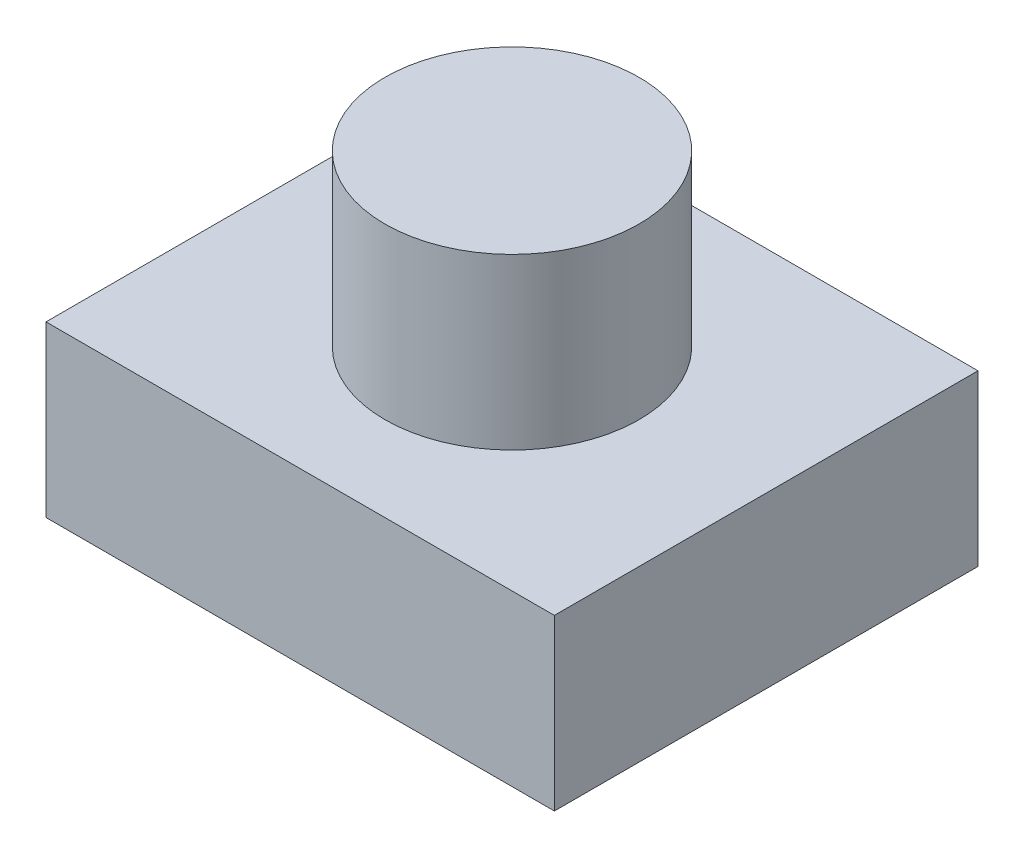
ISO-10303-21;
HEADER;
FILE_DESCRIPTION(('STEP AP214'),'2;1');
FILE_NAME('part.step','',(''),(''),'','','');
FILE_SCHEMA(('AUTOMOTIVE_DESIGN { 1 0 10303 214 1 1 1 1 }'));
ENDSEC;
DATA;
#1=APPLICATION_CONTEXT('core data for automotive mechanical design processes');
#2=APPLICATION_PROTOCOL_DEFINITION('international standard','automotive_design',2000,#1);
#3=PRODUCT_CONTEXT('',#1,'mechanical');
#4=PRODUCT('Part','Part','',(#3));
#5=PRODUCT_RELATED_PRODUCT_CATEGORY('part','',(#4));
#6=PRODUCT_DEFINITION_FORMATION('','',#4);
#7=PRODUCT_DEFINITION_CONTEXT('part definition',#1,'design');
#8=PRODUCT_DEFINITION('design','',#6,#7);
#9=PRODUCT_DEFINITION_SHAPE('','',#8);
#10=(LENGTH_UNIT() NAMED_UNIT(*) SI_UNIT(.MILLI.,.METRE.));
#11=(NAMED_UNIT(*) PLANE_ANGLE_UNIT() SI_UNIT($,.RADIAN.));
#12=(NAMED_UNIT(*) SI_UNIT($,.STERADIAN.) SOLID_ANGLE_UNIT());
#13=UNCERTAINTY_MEASURE_WITH_UNIT(LENGTH_MEASURE(1.E-05),#10,'distance_accuracy_value','');
#14=(GEOMETRIC_REPRESENTATION_CONTEXT(3) GLOBAL_UNCERTAINTY_ASSIGNED_CONTEXT((#13)) GLOBAL_UNIT_ASSIGNED_CONTEXT((#10,
#11,#12)) REPRESENTATION_CONTEXT('',''));
#15=CARTESIAN_POINT('',(0.,0.,0.));
#16=DIRECTION('',(0.,0.,1.));
#17=DIRECTION('',(1.,0.,0.));
#18=AXIS2_PLACEMENT_3D('',#15,#16,#17);
#19=CARTESIAN_POINT('',(-50.5445411922304,20.,13.2253851306095));
#20=DIRECTION('',(1.,0.,0.));
#21=DIRECTION('',(0.,0.,-1.));
#22=AXIS2_PLACEMENT_3D('',#19,#20,#21);
#23=PLANE('',#22);
#24=DIRECTION('',(0.,0.,1.));
#25=VECTOR('',#24,1.);
#26=CARTESIAN_POINT('',(-50.5445411922304,0.,13.2253851306095));
#27=LINE('',#26,#25);
#28=CARTESIAN_POINT('',(-50.5445411922304,0.,-36.7746148693905));
#29=VERTEX_POINT('',#28);
#30=CARTESIAN_POINT('',(-50.5445411922304,0.,13.2253851306095));
#31=VERTEX_POINT('',#30);
#32=EDGE_CURVE('E99',#29,#31,#27,.T.);
#33=ORIENTED_EDGE('',*,*,#32,.T.);
#34=DIRECTION('',(0.,-1.,0.));
#35=VECTOR('',#34,1.);
#36=CARTESIAN_POINT('',(-50.5445411922304,20.,13.2253851306095));
#37=LINE('',#36,#35);
#38=CARTESIAN_POINT('',(-50.5445411922304,20.,13.2253851306095));
#39=VERTEX_POINT('',#38);
#40=EDGE_CURVE('E36',#39,#31,#37,.T.);
#41=ORIENTED_EDGE('',*,*,#40,.F.);
#42=DIRECTION('',(0.,0.,1.));
#43=VECTOR('',#42,1.);
#44=CARTESIAN_POINT('',(-50.5445411922304,20.,13.2253851306095));
#45=LINE('',#44,#43);
#46=CARTESIAN_POINT('',(-50.5445411922304,20.,-36.7746148693905));
#47=VERTEX_POINT('',#46);
#48=EDGE_CURVE('E86',#47,#39,#45,.T.);
#49=ORIENTED_EDGE('',*,*,#48,.F.);
#50=DIRECTION('',(0.,-1.,0.));
#51=VECTOR('',#50,1.);
#52=CARTESIAN_POINT('',(-50.5445411922304,20.,-36.7746148693905));
#53=LINE('',#52,#51);
#54=EDGE_CURVE('E95',#47,#29,#53,.T.);
#55=ORIENTED_EDGE('',*,*,#54,.T.);
#56=EDGE_LOOP('',(#33,#41,#49,#55));
#57=FACE_BOUND('',#56,.T.);
#58=ADVANCED_FACE('F33',(#57),#23,.F.);
#59=CARTESIAN_POINT('',(-50.5445411922304,20.,13.2253851306095));
#60=DIRECTION('',(0.,0.,-1.));
#61=DIRECTION('',(-1.,0.,0.));
#62=AXIS2_PLACEMENT_3D('',#59,#60,#61);
#63=PLANE('',#62);
#64=DIRECTION('',(1.,0.,0.));
#65=VECTOR('',#64,1.);
#66=CARTESIAN_POINT('',(-50.5445411922304,0.,13.2253851306095));
#67=LINE('',#66,#65);
#68=CARTESIAN_POINT('',(9.4554588077696,0.,13.2253851306095));
#69=VERTEX_POINT('',#68);
#70=EDGE_CURVE('E91',#31,#69,#67,.T.);
#71=ORIENTED_EDGE('',*,*,#70,.T.);
#72=DIRECTION('',(0.,-1.,0.));
#73=VECTOR('',#72,1.);
#74=CARTESIAN_POINT('',(9.4554588077696,20.,13.2253851306095));
#75=LINE('',#74,#73);
#76=CARTESIAN_POINT('',(9.4554588077696,20.,13.2253851306095));
#77=VERTEX_POINT('',#76);
#78=EDGE_CURVE('E89',#77,#69,#75,.T.);
#79=ORIENTED_EDGE('',*,*,#78,.F.);
#80=DIRECTION('',(1.,0.,0.));
#81=VECTOR('',#80,1.);
#82=CARTESIAN_POINT('',(-50.5445411922304,20.,13.2253851306095));
#83=LINE('',#82,#81);
#84=EDGE_CURVE('E81',#39,#77,#83,.T.);
#85=ORIENTED_EDGE('',*,*,#84,.F.);
#86=ORIENTED_EDGE('',*,*,#40,.T.);
#87=EDGE_LOOP('',(#71,#79,#85,#86));
#88=FACE_BOUND('',#87,.T.);
#89=ADVANCED_FACE('F90',(#88),#63,.F.);
#90=CARTESIAN_POINT('',(9.4554588077696,20.,13.2253851306095));
#91=DIRECTION('',(-1.,0.,0.));
#92=DIRECTION('',(0.,0.,1.));
#93=AXIS2_PLACEMENT_3D('',#90,#91,#92);
#94=PLANE('',#93);
#95=DIRECTION('',(0.,0.,-1.));
#96=VECTOR('',#95,1.);
#97=CARTESIAN_POINT('',(9.4554588077696,0.,13.2253851306095));
#98=LINE('',#97,#96);
#99=CARTESIAN_POINT('',(9.4554588077696,0.,-36.7746148693905));
#100=VERTEX_POINT('',#99);
#101=EDGE_CURVE('E67',#69,#100,#98,.T.);
#102=ORIENTED_EDGE('',*,*,#101,.T.);
#103=DIRECTION('',(0.,-1.,0.));
#104=VECTOR('',#103,1.);
#105=CARTESIAN_POINT('',(9.4554588077696,20.,-36.7746148693905));
#106=LINE('',#105,#104);
#107=CARTESIAN_POINT('',(9.4554588077696,20.,-36.7746148693905));
#108=VERTEX_POINT('',#107);
#109=EDGE_CURVE('E92',#108,#100,#106,.T.);
#110=ORIENTED_EDGE('',*,*,#109,.F.);
#111=DIRECTION('',(0.,0.,-1.));
#112=VECTOR('',#111,1.);
#113=CARTESIAN_POINT('',(9.4554588077696,20.,13.2253851306095));
#114=LINE('',#113,#112);
#115=EDGE_CURVE('E84',#77,#108,#114,.T.);
#116=ORIENTED_EDGE('',*,*,#115,.F.);
#117=ORIENTED_EDGE('',*,*,#78,.T.);
#118=EDGE_LOOP('',(#102,#110,#116,#117));
#119=FACE_BOUND('',#118,.T.);
#120=ADVANCED_FACE('F93',(#119),#94,.F.);
#121=CARTESIAN_POINT('',(-50.5445411922304,20.,-36.7746148693905));
#122=DIRECTION('',(0.,0.,1.));
#123=DIRECTION('',(1.,0.,0.));
#124=AXIS2_PLACEMENT_3D('',#121,#122,#123);
#125=PLANE('',#124);
#126=DIRECTION('',(-1.,0.,0.));
#127=VECTOR('',#126,1.);
#128=CARTESIAN_POINT('',(-50.5445411922304,0.,-36.7746148693905));
#129=LINE('',#128,#127);
#130=EDGE_CURVE('E73',#100,#29,#129,.T.);
#131=ORIENTED_EDGE('',*,*,#130,.T.);
#132=ORIENTED_EDGE('',*,*,#54,.F.);
#133=DIRECTION('',(-1.,0.,0.));
#134=VECTOR('',#133,1.);
#135=CARTESIAN_POINT('',(-50.5445411922304,20.,-36.7746148693905));
#136=LINE('',#135,#134);
#137=EDGE_CURVE('E50',#108,#47,#136,.T.);
#138=ORIENTED_EDGE('',*,*,#137,.F.);
#139=ORIENTED_EDGE('',*,*,#109,.T.);
#140=EDGE_LOOP('',(#131,#132,#138,#139));
#141=FACE_BOUND('',#140,.T.);
#142=ADVANCED_FACE('F107',(#141),#125,.F.);
#143=CARTESIAN_POINT('',(0.,20.,0.));
#144=DIRECTION('',(0.,-1.,0.));
#145=DIRECTION('',(0.,0.,-1.));
#146=AXIS2_PLACEMENT_3D('',#143,#144,#145);
#147=PLANE('',#146);
#148=CARTESIAN_POINT('',(-20.5445411922304,20.,-11.7746148693905));
#149=DIRECTION('',(0.,1.,0.));
#150=DIRECTION('',(0.,0.,1.));
#151=AXIS2_PLACEMENT_3D('',#148,#149,#150);
#152=CIRCLE('',#151,15.);
#153=CARTESIAN_POINT('',(-20.5445411922304,20.,3.2253851306095));
#154=VERTEX_POINT('',#153);
#155=EDGE_CURVE('E11',#154,#154,#152,.T.);
#156=ORIENTED_EDGE('',*,*,#155,.F.);
#157=EDGE_LOOP('',(#156));
#158=FACE_BOUND('',#157,.T.);
#159=ORIENTED_EDGE('',*,*,#48,.T.);
#160=ORIENTED_EDGE('',*,*,#84,.T.);
#161=ORIENTED_EDGE('',*,*,#115,.T.);
#162=ORIENTED_EDGE('',*,*,#137,.T.);
#163=EDGE_LOOP('',(#159,#160,#161,#162));
#164=FACE_BOUND('',#163,.T.);
#165=ADVANCED_FACE('F82',(#158,#164),#147,.F.);
#166=CARTESIAN_POINT('',(0.,0.,0.));
#167=DIRECTION('',(0.,-1.,0.));
#168=DIRECTION('',(0.,0.,-1.));
#169=AXIS2_PLACEMENT_3D('',#166,#167,#168);
#170=PLANE('',#169);
#171=ORIENTED_EDGE('',*,*,#32,.F.);
#172=ORIENTED_EDGE('',*,*,#130,.F.);
#173=ORIENTED_EDGE('',*,*,#101,.F.);
#174=ORIENTED_EDGE('',*,*,#70,.F.);
#175=EDGE_LOOP('',(#171,#172,#173,#174));
#176=FACE_BOUND('',#175,.T.);
#177=ADVANCED_FACE('F110',(#176),#170,.T.);
#178=CARTESIAN_POINT('',(-20.5445411922304,40.,-11.7746148693905));
#179=DIRECTION('',(0.,-1.,0.));
#180=DIRECTION('',(0.,0.,-1.));
#181=AXIS2_PLACEMENT_3D('',#178,#179,#180);
#182=CYLINDRICAL_SURFACE('',#181,15.);
#183=CARTESIAN_POINT('',(-20.5445411922304,40.,-11.7746148693905));
#184=DIRECTION('',(0.,1.,0.));
#185=DIRECTION('',(0.,0.,1.));
#186=AXIS2_PLACEMENT_3D('',#183,#184,#185);
#187=CIRCLE('',#186,15.);
#188=CARTESIAN_POINT('',(-20.5445411922304,40.,3.2253851306095));
#189=VERTEX_POINT('',#188);
#190=EDGE_CURVE('E102',#189,#189,#187,.T.);
#191=ORIENTED_EDGE('',*,*,#190,.F.);
#192=EDGE_LOOP('',(#191));
#193=FACE_BOUND('',#192,.T.);
#194=ORIENTED_EDGE('',*,*,#155,.T.);
#195=EDGE_LOOP('',(#194));
#196=FACE_BOUND('',#195,.T.);
#197=ADVANCED_FACE('F118',(#193,#196),#182,.T.);
#198=CARTESIAN_POINT('',(-20.5445411922304,40.,-11.7746148693905));
#199=DIRECTION('',(0.,1.,0.));
#200=DIRECTION('',(0.,0.,1.));
#201=AXIS2_PLACEMENT_3D('',#198,#199,#200);
#202=PLANE('',#201);
#203=ORIENTED_EDGE('',*,*,#190,.T.);
#204=EDGE_LOOP('',(#203));
#205=FACE_BOUND('',#204,.T.);
#206=ADVANCED_FACE('F116',(#205),#202,.T.);
#207=CLOSED_SHELL('',(#58,#89,#120,#142,#165,#177,#197,#206));
#208=MANIFOLD_SOLID_BREP('B2',#207);
#209=ADVANCED_BREP_SHAPE_REPRESENTATION('',(#18,#208),#14);
#210=SHAPE_DEFINITION_REPRESENTATION(#9,#209);
ENDSEC;
END-ISO-10303-21;
